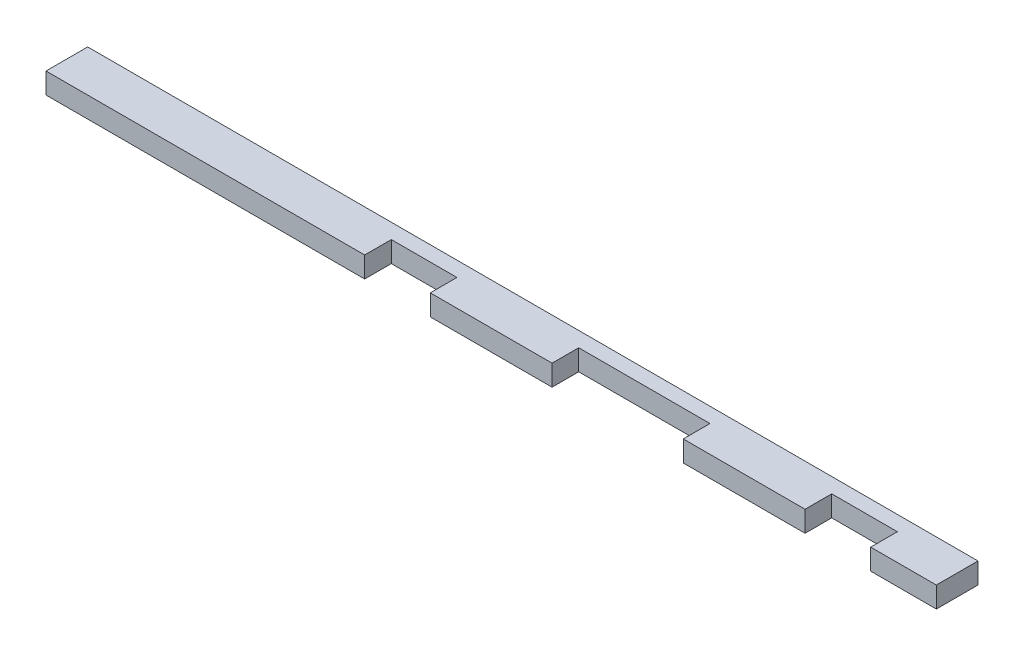
ISO-10303-21;
HEADER;
FILE_DESCRIPTION(('STEP AP214'),'2;1');
FILE_NAME('part.step','',(''),(''),'','','');
FILE_SCHEMA(('AUTOMOTIVE_DESIGN { 1 0 10303 214 1 1 1 1 }'));
ENDSEC;
DATA;
#1=APPLICATION_CONTEXT('core data for automotive mechanical design processes');
#2=APPLICATION_PROTOCOL_DEFINITION('international standard','automotive_design',2000,#1);
#3=PRODUCT_CONTEXT('',#1,'mechanical');
#4=PRODUCT('Part','Part','',(#3));
#5=PRODUCT_RELATED_PRODUCT_CATEGORY('part','',(#4));
#6=PRODUCT_DEFINITION_FORMATION('','',#4);
#7=PRODUCT_DEFINITION_CONTEXT('part definition',#1,'design');
#8=PRODUCT_DEFINITION('design','',#6,#7);
#9=PRODUCT_DEFINITION_SHAPE('','',#8);
#10=(LENGTH_UNIT() NAMED_UNIT(*) SI_UNIT(.MILLI.,.METRE.));
#11=(NAMED_UNIT(*) PLANE_ANGLE_UNIT() SI_UNIT($,.RADIAN.));
#12=(NAMED_UNIT(*) SI_UNIT($,.STERADIAN.) SOLID_ANGLE_UNIT());
#13=UNCERTAINTY_MEASURE_WITH_UNIT(LENGTH_MEASURE(1.E-05),#10,'distance_accuracy_value','');
#14=(GEOMETRIC_REPRESENTATION_CONTEXT(3) GLOBAL_UNCERTAINTY_ASSIGNED_CONTEXT((#13)) GLOBAL_UNIT_ASSIGNED_CONTEXT((#10,
#11,#12)) REPRESENTATION_CONTEXT('',''));
#15=CARTESIAN_POINT('',(0.,0.,0.));
#16=DIRECTION('',(0.,0.,1.));
#17=DIRECTION('',(1.,0.,0.));
#18=AXIS2_PLACEMENT_3D('',#15,#16,#17);
#19=CARTESIAN_POINT('',(0.,1.5875,-3.175));
#20=DIRECTION('',(1.,0.,0.));
#21=DIRECTION('',(0.,0.,-1.));
#22=AXIS2_PLACEMENT_3D('',#19,#20,#21);
#23=PLANE('',#22);
#24=DIRECTION('',(0.,0.,1.));
#25=VECTOR('',#24,1.);
#26=CARTESIAN_POINT('',(0.,0.,-3.175));
#27=LINE('',#26,#25);
#28=CARTESIAN_POINT('',(0.,0.,-3.175));
#29=VERTEX_POINT('',#28);
#30=CARTESIAN_POINT('',(0.,0.,0.));
#31=VERTEX_POINT('',#30);
#32=EDGE_CURVE('E177',#29,#31,#27,.T.);
#33=ORIENTED_EDGE('',*,*,#32,.T.);
#34=DIRECTION('',(0.,-1.,0.));
#35=VECTOR('',#34,1.);
#36=CARTESIAN_POINT('',(0.,1.5875,0.));
#37=LINE('',#36,#35);
#38=CARTESIAN_POINT('',(0.,1.5875,0.));
#39=VERTEX_POINT('',#38);
#40=EDGE_CURVE('E11',#39,#31,#37,.T.);
#41=ORIENTED_EDGE('',*,*,#40,.F.);
#42=DIRECTION('',(0.,0.,1.));
#43=VECTOR('',#42,1.);
#44=CARTESIAN_POINT('',(0.,1.5875,-3.175));
#45=LINE('',#44,#43);
#46=CARTESIAN_POINT('',(0.,1.5875,-3.175));
#47=VERTEX_POINT('',#46);
#48=EDGE_CURVE('E207',#47,#39,#45,.T.);
#49=ORIENTED_EDGE('',*,*,#48,.F.);
#50=DIRECTION('',(0.,-1.,0.));
#51=VECTOR('',#50,1.);
#52=CARTESIAN_POINT('',(0.,1.5875,-3.175));
#53=LINE('',#52,#51);
#54=EDGE_CURVE('E173',#47,#29,#53,.T.);
#55=ORIENTED_EDGE('',*,*,#54,.T.);
#56=EDGE_LOOP('',(#33,#41,#49,#55));
#57=FACE_BOUND('',#56,.T.);
#58=ADVANCED_FACE('F33',(#57),#23,.F.);
#59=CARTESIAN_POINT('',(0.,1.5875,0.));
#60=DIRECTION('',(0.,0.,-1.));
#61=DIRECTION('',(-1.,0.,0.));
#62=AXIS2_PLACEMENT_3D('',#59,#60,#61);
#63=PLANE('',#62);
#64=DIRECTION('',(1.,0.,0.));
#65=VECTOR('',#64,1.);
#66=CARTESIAN_POINT('',(0.,0.,0.));
#67=LINE('',#66,#65);
#68=CARTESIAN_POINT('',(24.27563042,0.,0.));
#69=VERTEX_POINT('',#68);
#70=EDGE_CURVE('E180',#31,#69,#67,.T.);
#71=ORIENTED_EDGE('',*,*,#70,.T.);
#72=DIRECTION('',(0.,-1.,0.));
#73=VECTOR('',#72,1.);
#74=CARTESIAN_POINT('',(24.27563042,1.5875,0.));
#75=LINE('',#74,#73);
#76=CARTESIAN_POINT('',(24.27563042,1.5875,0.));
#77=VERTEX_POINT('',#76);
#78=EDGE_CURVE('E41',#77,#69,#75,.T.);
#79=ORIENTED_EDGE('',*,*,#78,.F.);
#80=DIRECTION('',(1.,0.,0.));
#81=VECTOR('',#80,1.);
#82=CARTESIAN_POINT('',(0.,1.5875,0.));
#83=LINE('',#82,#81);
#84=EDGE_CURVE('E116',#39,#77,#83,.T.);
#85=ORIENTED_EDGE('',*,*,#84,.F.);
#86=ORIENTED_EDGE('',*,*,#40,.T.);
#87=EDGE_LOOP('',(#71,#79,#85,#86));
#88=FACE_BOUND('',#87,.T.);
#89=ADVANCED_FACE('F305',(#88),#63,.F.);
#90=CARTESIAN_POINT('',(24.27563042,1.5875,-2.032));
#91=DIRECTION('',(-1.,0.,0.));
#92=DIRECTION('',(0.,0.,1.));
#93=AXIS2_PLACEMENT_3D('',#90,#91,#92);
#94=PLANE('',#93);
#95=DIRECTION('',(0.,0.,-1.));
#96=VECTOR('',#95,1.);
#97=CARTESIAN_POINT('',(24.27563042,0.,-2.032));
#98=LINE('',#97,#96);
#99=CARTESIAN_POINT('',(24.27563042,0.,-2.032));
#100=VERTEX_POINT('',#99);
#101=EDGE_CURVE('E182',#69,#100,#98,.T.);
#102=ORIENTED_EDGE('',*,*,#101,.T.);
#103=DIRECTION('',(0.,-1.,0.));
#104=VECTOR('',#103,1.);
#105=CARTESIAN_POINT('',(24.27563042,1.5875,-2.032));
#106=LINE('',#105,#104);
#107=CARTESIAN_POINT('',(24.27563042,1.5875,-2.032));
#108=VERTEX_POINT('',#107);
#109=EDGE_CURVE('E238',#108,#100,#106,.T.);
#110=ORIENTED_EDGE('',*,*,#109,.F.);
#111=DIRECTION('',(0.,0.,-1.));
#112=VECTOR('',#111,1.);
#113=CARTESIAN_POINT('',(24.27563042,1.5875,-2.032));
#114=LINE('',#113,#112);
#115=EDGE_CURVE('E246',#77,#108,#114,.T.);
#116=ORIENTED_EDGE('',*,*,#115,.F.);
#117=ORIENTED_EDGE('',*,*,#78,.T.);
#118=EDGE_LOOP('',(#102,#110,#116,#117));
#119=FACE_BOUND('',#118,.T.);
#120=ADVANCED_FACE('F244',(#119),#94,.F.);
#121=CARTESIAN_POINT('',(24.27563042,1.5875,-2.032));
#122=DIRECTION('',(0.,0.,-1.));
#123=DIRECTION('',(-1.,0.,0.));
#124=AXIS2_PLACEMENT_3D('',#121,#122,#123);
#125=PLANE('',#124);
#126=DIRECTION('',(1.,0.,0.));
#127=VECTOR('',#126,1.);
#128=CARTESIAN_POINT('',(24.27563042,0.,-2.032));
#129=LINE('',#128,#127);
#130=CARTESIAN_POINT('',(29.27563042,0.,-2.032));
#131=VERTEX_POINT('',#130);
#132=EDGE_CURVE('E184',#100,#131,#129,.T.);
#133=ORIENTED_EDGE('',*,*,#132,.T.);
#134=DIRECTION('',(0.,-1.,0.));
#135=VECTOR('',#134,1.);
#136=CARTESIAN_POINT('',(29.27563042,1.5875,-2.032));
#137=LINE('',#136,#135);
#138=CARTESIAN_POINT('',(29.27563042,1.5875,-2.032));
#139=VERTEX_POINT('',#138);
#140=EDGE_CURVE('E235',#139,#131,#137,.T.);
#141=ORIENTED_EDGE('',*,*,#140,.F.);
#142=DIRECTION('',(1.,0.,0.));
#143=VECTOR('',#142,1.);
#144=CARTESIAN_POINT('',(24.27563042,1.5875,-2.032));
#145=LINE('',#144,#143);
#146=EDGE_CURVE('E264',#108,#139,#145,.T.);
#147=ORIENTED_EDGE('',*,*,#146,.F.);
#148=ORIENTED_EDGE('',*,*,#109,.T.);
#149=EDGE_LOOP('',(#133,#141,#147,#148));
#150=FACE_BOUND('',#149,.T.);
#151=ADVANCED_FACE('F255',(#150),#125,.F.);
#152=CARTESIAN_POINT('',(29.27563042,1.5875,-2.032));
#153=DIRECTION('',(1.,0.,0.));
#154=DIRECTION('',(0.,0.,-1.));
#155=AXIS2_PLACEMENT_3D('',#152,#153,#154);
#156=PLANE('',#155);
#157=DIRECTION('',(0.,0.,1.));
#158=VECTOR('',#157,1.);
#159=CARTESIAN_POINT('',(29.27563042,0.,-2.032));
#160=LINE('',#159,#158);
#161=CARTESIAN_POINT('',(29.27563042,0.,0.));
#162=VERTEX_POINT('',#161);
#163=EDGE_CURVE('E186',#131,#162,#160,.T.);
#164=ORIENTED_EDGE('',*,*,#163,.T.);
#165=DIRECTION('',(0.,-1.,0.));
#166=VECTOR('',#165,1.);
#167=CARTESIAN_POINT('',(29.27563042,1.5875,0.));
#168=LINE('',#167,#166);
#169=CARTESIAN_POINT('',(29.27563042,1.5875,0.));
#170=VERTEX_POINT('',#169);
#171=EDGE_CURVE('E232',#170,#162,#168,.T.);
#172=ORIENTED_EDGE('',*,*,#171,.F.);
#173=DIRECTION('',(0.,0.,1.));
#174=VECTOR('',#173,1.);
#175=CARTESIAN_POINT('',(29.27563042,1.5875,-2.032));
#176=LINE('',#175,#174);
#177=EDGE_CURVE('E261',#139,#170,#176,.T.);
#178=ORIENTED_EDGE('',*,*,#177,.F.);
#179=ORIENTED_EDGE('',*,*,#140,.T.);
#180=EDGE_LOOP('',(#164,#172,#178,#179));
#181=FACE_BOUND('',#180,.T.);
#182=ADVANCED_FACE('F259',(#181),#156,.F.);
#183=CARTESIAN_POINT('',(29.27563042,1.5875,0.));
#184=DIRECTION('',(0.,0.,-1.));
#185=DIRECTION('',(-1.,0.,0.));
#186=AXIS2_PLACEMENT_3D('',#183,#184,#185);
#187=PLANE('',#186);
#188=DIRECTION('',(1.,0.,0.));
#189=VECTOR('',#188,1.);
#190=CARTESIAN_POINT('',(29.27563042,0.,0.));
#191=LINE('',#190,#189);
#192=CARTESIAN_POINT('',(38.55125958,0.,0.));
#193=VERTEX_POINT('',#192);
#194=EDGE_CURVE('E188',#162,#193,#191,.T.);
#195=ORIENTED_EDGE('',*,*,#194,.T.);
#196=DIRECTION('',(0.,-1.,0.));
#197=VECTOR('',#196,1.);
#198=CARTESIAN_POINT('',(38.55125958,1.5875,0.));
#199=LINE('',#198,#197);
#200=CARTESIAN_POINT('',(38.55125958,1.5875,0.));
#201=VERTEX_POINT('',#200);
#202=EDGE_CURVE('E229',#201,#193,#199,.T.);
#203=ORIENTED_EDGE('',*,*,#202,.F.);
#204=DIRECTION('',(1.,0.,0.));
#205=VECTOR('',#204,1.);
#206=CARTESIAN_POINT('',(29.27563042,1.5875,0.));
#207=LINE('',#206,#205);
#208=EDGE_CURVE('E263',#170,#201,#207,.T.);
#209=ORIENTED_EDGE('',*,*,#208,.F.);
#210=ORIENTED_EDGE('',*,*,#171,.T.);
#211=EDGE_LOOP('',(#195,#203,#209,#210));
#212=FACE_BOUND('',#211,.T.);
#213=ADVANCED_FACE('F318',(#212),#187,.F.);
#214=CARTESIAN_POINT('',(38.55125958,1.5875,-2.032));
#215=DIRECTION('',(-1.,0.,0.));
#216=DIRECTION('',(0.,0.,1.));
#217=AXIS2_PLACEMENT_3D('',#214,#215,#216);
#218=PLANE('',#217);
#219=DIRECTION('',(0.,0.,-1.));
#220=VECTOR('',#219,1.);
#221=CARTESIAN_POINT('',(38.55125958,0.,-2.032));
#222=LINE('',#221,#220);
#223=CARTESIAN_POINT('',(38.55125958,0.,-2.032));
#224=VERTEX_POINT('',#223);
#225=EDGE_CURVE('E190',#193,#224,#222,.T.);
#226=ORIENTED_EDGE('',*,*,#225,.T.);
#227=DIRECTION('',(0.,-1.,0.));
#228=VECTOR('',#227,1.);
#229=CARTESIAN_POINT('',(38.55125958,1.5875,-2.032));
#230=LINE('',#229,#228);
#231=CARTESIAN_POINT('',(38.55125958,1.5875,-2.032));
#232=VERTEX_POINT('',#231);
#233=EDGE_CURVE('E226',#232,#224,#230,.T.);
#234=ORIENTED_EDGE('',*,*,#233,.F.);
#235=DIRECTION('',(0.,0.,-1.));
#236=VECTOR('',#235,1.);
#237=CARTESIAN_POINT('',(38.55125958,1.5875,-2.032));
#238=LINE('',#237,#236);
#239=EDGE_CURVE('E266',#201,#232,#238,.T.);
#240=ORIENTED_EDGE('',*,*,#239,.F.);
#241=ORIENTED_EDGE('',*,*,#202,.T.);
#242=EDGE_LOOP('',(#226,#234,#240,#241));
#243=FACE_BOUND('',#242,.T.);
#244=ADVANCED_FACE('F321',(#243),#218,.F.);
#245=CARTESIAN_POINT('',(38.55125958,1.5875,-2.032));
#246=DIRECTION('',(0.,0.,-1.));
#247=DIRECTION('',(-1.,0.,0.));
#248=AXIS2_PLACEMENT_3D('',#245,#246,#247);
#249=PLANE('',#248);
#250=DIRECTION('',(1.,0.,0.));
#251=VECTOR('',#250,1.);
#252=CARTESIAN_POINT('',(38.55125958,0.,-2.032));
#253=LINE('',#252,#251);
#254=CARTESIAN_POINT('',(48.55125958,0.,-2.032));
#255=VERTEX_POINT('',#254);
#256=EDGE_CURVE('E192',#224,#255,#253,.T.);
#257=ORIENTED_EDGE('',*,*,#256,.T.);
#258=DIRECTION('',(0.,-1.,0.));
#259=VECTOR('',#258,1.);
#260=CARTESIAN_POINT('',(48.55125958,1.5875,-2.032));
#261=LINE('',#260,#259);
#262=CARTESIAN_POINT('',(48.55125958,1.5875,-2.032));
#263=VERTEX_POINT('',#262);
#264=EDGE_CURVE('E223',#263,#255,#261,.T.);
#265=ORIENTED_EDGE('',*,*,#264,.F.);
#266=DIRECTION('',(1.,0.,0.));
#267=VECTOR('',#266,1.);
#268=CARTESIAN_POINT('',(38.55125958,1.5875,-2.032));
#269=LINE('',#268,#267);
#270=EDGE_CURVE('E272',#232,#263,#269,.T.);
#271=ORIENTED_EDGE('',*,*,#270,.F.);
#272=ORIENTED_EDGE('',*,*,#233,.T.);
#273=EDGE_LOOP('',(#257,#265,#271,#272));
#274=FACE_BOUND('',#273,.T.);
#275=ADVANCED_FACE('F325',(#274),#249,.F.);
#276=CARTESIAN_POINT('',(48.55125958,1.5875,-2.032));
#277=DIRECTION('',(1.,0.,0.));
#278=DIRECTION('',(0.,0.,-1.));
#279=AXIS2_PLACEMENT_3D('',#276,#277,#278);
#280=PLANE('',#279);
#281=DIRECTION('',(0.,0.,1.));
#282=VECTOR('',#281,1.);
#283=CARTESIAN_POINT('',(48.55125958,0.,-2.032));
#284=LINE('',#283,#282);
#285=CARTESIAN_POINT('',(48.55125958,0.,0.));
#286=VERTEX_POINT('',#285);
#287=EDGE_CURVE('E194',#255,#286,#284,.T.);
#288=ORIENTED_EDGE('',*,*,#287,.T.);
#289=DIRECTION('',(0.,-1.,0.));
#290=VECTOR('',#289,1.);
#291=CARTESIAN_POINT('',(48.55125958,1.5875,0.));
#292=LINE('',#291,#290);
#293=CARTESIAN_POINT('',(48.55125958,1.5875,0.));
#294=VERTEX_POINT('',#293);
#295=EDGE_CURVE('E220',#294,#286,#292,.T.);
#296=ORIENTED_EDGE('',*,*,#295,.F.);
#297=DIRECTION('',(0.,0.,1.));
#298=VECTOR('',#297,1.);
#299=CARTESIAN_POINT('',(48.55125958,1.5875,-2.032));
#300=LINE('',#299,#298);
#301=EDGE_CURVE('E274',#263,#294,#300,.T.);
#302=ORIENTED_EDGE('',*,*,#301,.F.);
#303=ORIENTED_EDGE('',*,*,#264,.T.);
#304=EDGE_LOOP('',(#288,#296,#302,#303));
#305=FACE_BOUND('',#304,.T.);
#306=ADVANCED_FACE('F329',(#305),#280,.F.);
#307=CARTESIAN_POINT('',(48.55125958,1.5875,0.));
#308=DIRECTION('',(0.,0.,-1.));
#309=DIRECTION('',(-1.,0.,0.));
#310=AXIS2_PLACEMENT_3D('',#307,#308,#309);
#311=PLANE('',#310);
#312=DIRECTION('',(1.,0.,0.));
#313=VECTOR('',#312,1.);
#314=CARTESIAN_POINT('',(48.55125958,0.,0.));
#315=LINE('',#314,#313);
#316=CARTESIAN_POINT('',(57.82689,0.,0.));
#317=VERTEX_POINT('',#316);
#318=EDGE_CURVE('E196',#286,#317,#315,.T.);
#319=ORIENTED_EDGE('',*,*,#318,.T.);
#320=DIRECTION('',(0.,-1.,0.));
#321=VECTOR('',#320,1.);
#322=CARTESIAN_POINT('',(57.82689,1.5875,0.));
#323=LINE('',#322,#321);
#324=CARTESIAN_POINT('',(57.82689,1.5875,0.));
#325=VERTEX_POINT('',#324);
#326=EDGE_CURVE('E217',#325,#317,#323,.T.);
#327=ORIENTED_EDGE('',*,*,#326,.F.);
#328=DIRECTION('',(1.,0.,0.));
#329=VECTOR('',#328,1.);
#330=CARTESIAN_POINT('',(48.55125958,1.5875,0.));
#331=LINE('',#330,#329);
#332=EDGE_CURVE('E276',#294,#325,#331,.T.);
#333=ORIENTED_EDGE('',*,*,#332,.F.);
#334=ORIENTED_EDGE('',*,*,#295,.T.);
#335=EDGE_LOOP('',(#319,#327,#333,#334));
#336=FACE_BOUND('',#335,.T.);
#337=ADVANCED_FACE('F333',(#336),#311,.F.);
#338=CARTESIAN_POINT('',(57.82689,1.5875,-2.032));
#339=DIRECTION('',(-1.,0.,0.));
#340=DIRECTION('',(0.,0.,1.));
#341=AXIS2_PLACEMENT_3D('',#338,#339,#340);
#342=PLANE('',#341);
#343=DIRECTION('',(0.,0.,-1.));
#344=VECTOR('',#343,1.);
#345=CARTESIAN_POINT('',(57.82689,0.,-2.032));
#346=LINE('',#345,#344);
#347=CARTESIAN_POINT('',(57.82689,0.,-2.032));
#348=VERTEX_POINT('',#347);
#349=EDGE_CURVE('E198',#317,#348,#346,.T.);
#350=ORIENTED_EDGE('',*,*,#349,.T.);
#351=DIRECTION('',(0.,-1.,0.));
#352=VECTOR('',#351,1.);
#353=CARTESIAN_POINT('',(57.82689,1.5875,-2.032));
#354=LINE('',#353,#352);
#355=CARTESIAN_POINT('',(57.82689,1.5875,-2.032));
#356=VERTEX_POINT('',#355);
#357=EDGE_CURVE('E214',#356,#348,#354,.T.);
#358=ORIENTED_EDGE('',*,*,#357,.F.);
#359=DIRECTION('',(0.,0.,-1.));
#360=VECTOR('',#359,1.);
#361=CARTESIAN_POINT('',(57.82689,1.5875,-2.032));
#362=LINE('',#361,#360);
#363=EDGE_CURVE('E278',#325,#356,#362,.T.);
#364=ORIENTED_EDGE('',*,*,#363,.F.);
#365=ORIENTED_EDGE('',*,*,#326,.T.);
#366=EDGE_LOOP('',(#350,#358,#364,#365));
#367=FACE_BOUND('',#366,.T.);
#368=ADVANCED_FACE('F337',(#367),#342,.F.);
#369=CARTESIAN_POINT('',(57.82689,1.5875,-2.032));
#370=DIRECTION('',(0.,0.,-1.));
#371=DIRECTION('',(-1.,0.,0.));
#372=AXIS2_PLACEMENT_3D('',#369,#370,#371);
#373=PLANE('',#372);
#374=DIRECTION('',(1.,0.,0.));
#375=VECTOR('',#374,1.);
#376=CARTESIAN_POINT('',(57.82689,0.,-2.032));
#377=LINE('',#376,#375);
#378=CARTESIAN_POINT('',(62.82689,0.,-2.032));
#379=VERTEX_POINT('',#378);
#380=EDGE_CURVE('E200',#348,#379,#377,.T.);
#381=ORIENTED_EDGE('',*,*,#380,.T.);
#382=DIRECTION('',(0.,-1.,0.));
#383=VECTOR('',#382,1.);
#384=CARTESIAN_POINT('',(62.82689,1.5875,-2.032));
#385=LINE('',#384,#383);
#386=CARTESIAN_POINT('',(62.82689,1.5875,-2.032));
#387=VERTEX_POINT('',#386);
#388=EDGE_CURVE('E211',#387,#379,#385,.T.);
#389=ORIENTED_EDGE('',*,*,#388,.F.);
#390=DIRECTION('',(1.,0.,0.));
#391=VECTOR('',#390,1.);
#392=CARTESIAN_POINT('',(57.82689,1.5875,-2.032));
#393=LINE('',#392,#391);
#394=EDGE_CURVE('E280',#356,#387,#393,.T.);
#395=ORIENTED_EDGE('',*,*,#394,.F.);
#396=ORIENTED_EDGE('',*,*,#357,.T.);
#397=EDGE_LOOP('',(#381,#389,#395,#396));
#398=FACE_BOUND('',#397,.T.);
#399=ADVANCED_FACE('F286',(#398),#373,.F.);
#400=CARTESIAN_POINT('',(62.82689,1.5875,0.));
#401=DIRECTION('',(1.,0.,0.));
#402=DIRECTION('',(0.,0.,-1.));
#403=AXIS2_PLACEMENT_3D('',#400,#401,#402);
#404=PLANE('',#403);
#405=DIRECTION('',(0.,0.,1.));
#406=VECTOR('',#405,1.);
#407=CARTESIAN_POINT('',(62.82689,0.,0.));
#408=LINE('',#407,#406);
#409=CARTESIAN_POINT('',(62.82689,0.,0.));
#410=VERTEX_POINT('',#409);
#411=EDGE_CURVE('E202',#379,#410,#408,.T.);
#412=ORIENTED_EDGE('',*,*,#411,.T.);
#413=DIRECTION('',(0.,-1.,0.));
#414=VECTOR('',#413,1.);
#415=CARTESIAN_POINT('',(62.82689,1.5875,0.));
#416=LINE('',#415,#414);
#417=CARTESIAN_POINT('',(62.82689,1.5875,0.));
#418=VERTEX_POINT('',#417);
#419=EDGE_CURVE('E168',#418,#410,#416,.T.);
#420=ORIENTED_EDGE('',*,*,#419,.F.);
#421=DIRECTION('',(0.,0.,1.));
#422=VECTOR('',#421,1.);
#423=CARTESIAN_POINT('',(62.82689,1.5875,0.));
#424=LINE('',#423,#422);
#425=EDGE_CURVE('E159',#387,#418,#424,.T.);
#426=ORIENTED_EDGE('',*,*,#425,.F.);
#427=ORIENTED_EDGE('',*,*,#388,.T.);
#428=EDGE_LOOP('',(#412,#420,#426,#427));
#429=FACE_BOUND('',#428,.T.);
#430=ADVANCED_FACE('F290',(#429),#404,.F.);
#431=CARTESIAN_POINT('',(62.82689,1.5875,0.));
#432=DIRECTION('',(0.,0.,-1.));
#433=DIRECTION('',(-1.,0.,0.));
#434=AXIS2_PLACEMENT_3D('',#431,#432,#433);
#435=PLANE('',#434);
#436=DIRECTION('',(1.,0.,0.));
#437=VECTOR('',#436,1.);
#438=CARTESIAN_POINT('',(62.82689,0.,0.));
#439=LINE('',#438,#437);
#440=CARTESIAN_POINT('',(67.82689,0.,0.));
#441=VERTEX_POINT('',#440);
#442=EDGE_CURVE('E167',#410,#441,#439,.T.);
#443=ORIENTED_EDGE('',*,*,#442,.T.);
#444=DIRECTION('',(0.,-1.,0.));
#445=VECTOR('',#444,1.);
#446=CARTESIAN_POINT('',(67.82689,1.5875,0.));
#447=LINE('',#446,#445);
#448=CARTESIAN_POINT('',(67.82689,1.5875,0.));
#449=VERTEX_POINT('',#448);
#450=EDGE_CURVE('E164',#449,#441,#447,.T.);
#451=ORIENTED_EDGE('',*,*,#450,.F.);
#452=DIRECTION('',(1.,0.,0.));
#453=VECTOR('',#452,1.);
#454=CARTESIAN_POINT('',(62.82689,1.5875,0.));
#455=LINE('',#454,#453);
#456=EDGE_CURVE('E153',#418,#449,#455,.T.);
#457=ORIENTED_EDGE('',*,*,#456,.F.);
#458=ORIENTED_EDGE('',*,*,#419,.T.);
#459=EDGE_LOOP('',(#443,#451,#457,#458));
#460=FACE_BOUND('',#459,.T.);
#461=ADVANCED_FACE('F165',(#460),#435,.F.);
#462=CARTESIAN_POINT('',(67.82689,1.5875,-3.175));
#463=DIRECTION('',(-1.,0.,0.));
#464=DIRECTION('',(0.,0.,1.));
#465=AXIS2_PLACEMENT_3D('',#462,#463,#464);
#466=PLANE('',#465);
#467=DIRECTION('',(0.,0.,-1.));
#468=VECTOR('',#467,1.);
#469=CARTESIAN_POINT('',(67.82689,0.,-3.175));
#470=LINE('',#469,#468);
#471=CARTESIAN_POINT('',(67.82689,0.,-3.175));
#472=VERTEX_POINT('',#471);
#473=EDGE_CURVE('E102',#441,#472,#470,.T.);
#474=ORIENTED_EDGE('',*,*,#473,.T.);
#475=DIRECTION('',(0.,-1.,0.));
#476=VECTOR('',#475,1.);
#477=CARTESIAN_POINT('',(67.82689,1.5875,-3.175));
#478=LINE('',#477,#476);
#479=CARTESIAN_POINT('',(67.82689,1.5875,-3.175));
#480=VERTEX_POINT('',#479);
#481=EDGE_CURVE('E169',#480,#472,#478,.T.);
#482=ORIENTED_EDGE('',*,*,#481,.F.);
#483=DIRECTION('',(0.,0.,-1.));
#484=VECTOR('',#483,1.);
#485=CARTESIAN_POINT('',(67.82689,1.5875,-3.175));
#486=LINE('',#485,#484);
#487=EDGE_CURVE('E157',#449,#480,#486,.T.);
#488=ORIENTED_EDGE('',*,*,#487,.F.);
#489=ORIENTED_EDGE('',*,*,#450,.T.);
#490=EDGE_LOOP('',(#474,#482,#488,#489));
#491=FACE_BOUND('',#490,.T.);
#492=ADVANCED_FACE('F171',(#491),#466,.F.);
#493=CARTESIAN_POINT('',(0.,1.5875,-3.175));
#494=DIRECTION('',(0.,0.,1.));
#495=DIRECTION('',(1.,0.,0.));
#496=AXIS2_PLACEMENT_3D('',#493,#494,#495);
#497=PLANE('',#496);
#498=DIRECTION('',(-1.,0.,0.));
#499=VECTOR('',#498,1.);
#500=CARTESIAN_POINT('',(0.,0.,-3.175));
#501=LINE('',#500,#499);
#502=EDGE_CURVE('E108',#472,#29,#501,.T.);
#503=ORIENTED_EDGE('',*,*,#502,.T.);
#504=ORIENTED_EDGE('',*,*,#54,.F.);
#505=DIRECTION('',(-1.,0.,0.));
#506=VECTOR('',#505,1.);
#507=CARTESIAN_POINT('',(0.,1.5875,-3.175));
#508=LINE('',#507,#506);
#509=EDGE_CURVE('E49',#480,#47,#508,.T.);
#510=ORIENTED_EDGE('',*,*,#509,.F.);
#511=ORIENTED_EDGE('',*,*,#481,.T.);
#512=EDGE_LOOP('',(#503,#504,#510,#511));
#513=FACE_BOUND('',#512,.T.);
#514=ADVANCED_FACE('F294',(#513),#497,.F.);
#515=CARTESIAN_POINT('',(0.,1.5875,0.));
#516=DIRECTION('',(0.,1.,0.));
#517=DIRECTION('',(0.,0.,1.));
#518=AXIS2_PLACEMENT_3D('',#515,#516,#517);
#519=PLANE('',#518);
#520=ORIENTED_EDGE('',*,*,#48,.T.);
#521=ORIENTED_EDGE('',*,*,#84,.T.);
#522=ORIENTED_EDGE('',*,*,#115,.T.);
#523=ORIENTED_EDGE('',*,*,#146,.T.);
#524=ORIENTED_EDGE('',*,*,#177,.T.);
#525=ORIENTED_EDGE('',*,*,#208,.T.);
#526=ORIENTED_EDGE('',*,*,#239,.T.);
#527=ORIENTED_EDGE('',*,*,#270,.T.);
#528=ORIENTED_EDGE('',*,*,#301,.T.);
#529=ORIENTED_EDGE('',*,*,#332,.T.);
#530=ORIENTED_EDGE('',*,*,#363,.T.);
#531=ORIENTED_EDGE('',*,*,#394,.T.);
#532=ORIENTED_EDGE('',*,*,#425,.T.);
#533=ORIENTED_EDGE('',*,*,#456,.T.);
#534=ORIENTED_EDGE('',*,*,#487,.T.);
#535=ORIENTED_EDGE('',*,*,#509,.T.);
#536=EDGE_LOOP('',(#520,#521,#522,#523,#524,#525,#526,#527,#528,#529,#530,#531,#532,#533,#534,#535));
#537=FACE_BOUND('',#536,.T.);
#538=ADVANCED_FACE('F155',(#537),#519,.T.);
#539=CARTESIAN_POINT('',(0.,0.,0.));
#540=DIRECTION('',(0.,1.,0.));
#541=DIRECTION('',(0.,0.,1.));
#542=AXIS2_PLACEMENT_3D('',#539,#540,#541);
#543=PLANE('',#542);
#544=ORIENTED_EDGE('',*,*,#32,.F.);
#545=ORIENTED_EDGE('',*,*,#502,.F.);
#546=ORIENTED_EDGE('',*,*,#473,.F.);
#547=ORIENTED_EDGE('',*,*,#442,.F.);
#548=ORIENTED_EDGE('',*,*,#411,.F.);
#549=ORIENTED_EDGE('',*,*,#380,.F.);
#550=ORIENTED_EDGE('',*,*,#349,.F.);
#551=ORIENTED_EDGE('',*,*,#318,.F.);
#552=ORIENTED_EDGE('',*,*,#287,.F.);
#553=ORIENTED_EDGE('',*,*,#256,.F.);
#554=ORIENTED_EDGE('',*,*,#225,.F.);
#555=ORIENTED_EDGE('',*,*,#194,.F.);
#556=ORIENTED_EDGE('',*,*,#163,.F.);
#557=ORIENTED_EDGE('',*,*,#132,.F.);
#558=ORIENTED_EDGE('',*,*,#101,.F.);
#559=ORIENTED_EDGE('',*,*,#70,.F.);
#560=EDGE_LOOP('',(#544,#545,#546,#547,#548,#549,#550,#551,#552,#553,#554,#555,#556,#557,#558,#559));
#561=FACE_BOUND('',#560,.T.);
#562=ADVANCED_FACE('F250',(#561),#543,.F.);
#563=CLOSED_SHELL('',(#58,#89,#120,#151,#182,#213,#244,#275,#306,#337,#368,#399,#430,#461,#492,
#514,#538,#562));
#564=MANIFOLD_SOLID_BREP('B2',#563);
#565=ADVANCED_BREP_SHAPE_REPRESENTATION('',(#18,#564),#14);
#566=SHAPE_DEFINITION_REPRESENTATION(#9,#565);
ENDSEC;
END-ISO-10303-21;
